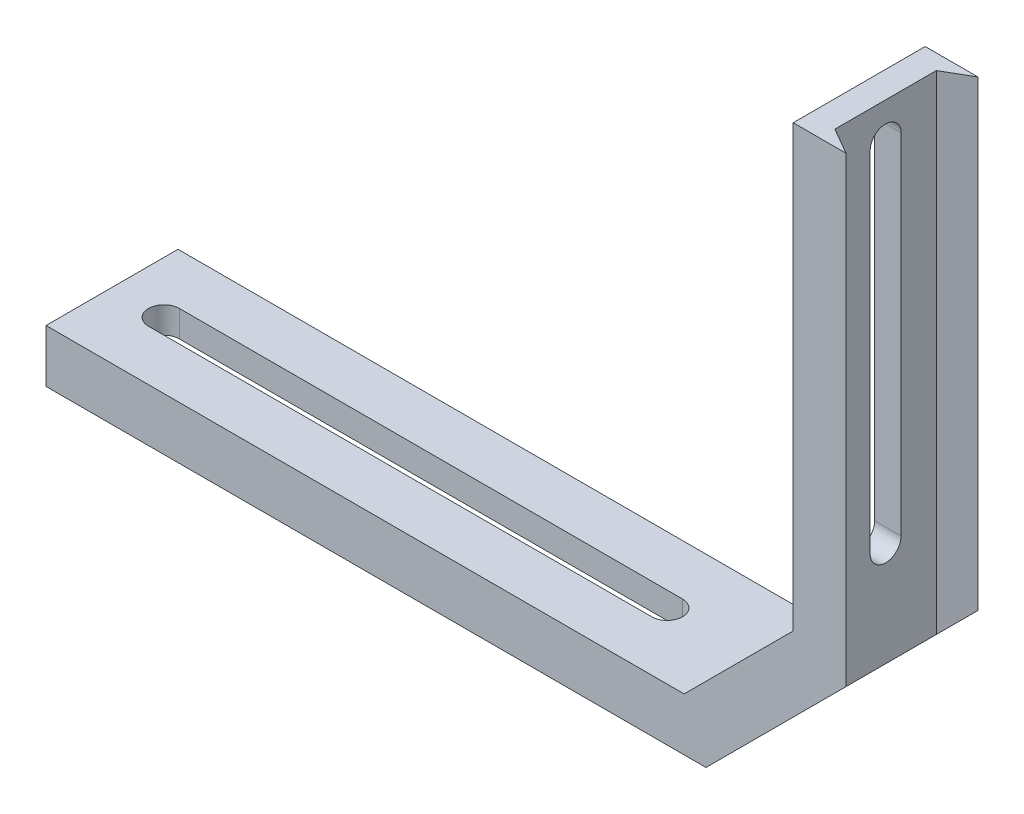
ISO-10303-21;
HEADER;
FILE_DESCRIPTION(('STEP AP214'),'2;1');
FILE_NAME('part.step','',(''),(''),'','','');
FILE_SCHEMA(('AUTOMOTIVE_DESIGN { 1 0 10303 214 1 1 1 1 }'));
ENDSEC;
DATA;
#1=APPLICATION_CONTEXT('core data for automotive mechanical design processes');
#2=APPLICATION_PROTOCOL_DEFINITION('international standard','automotive_design',2000,#1);
#3=PRODUCT_CONTEXT('',#1,'mechanical');
#4=PRODUCT('Part','Part','',(#3));
#5=PRODUCT_RELATED_PRODUCT_CATEGORY('part','',(#4));
#6=PRODUCT_DEFINITION_FORMATION('','',#4);
#7=PRODUCT_DEFINITION_CONTEXT('part definition',#1,'design');
#8=PRODUCT_DEFINITION('design','',#6,#7);
#9=PRODUCT_DEFINITION_SHAPE('','',#8);
#10=(LENGTH_UNIT() NAMED_UNIT(*) SI_UNIT(.MILLI.,.METRE.));
#11=(NAMED_UNIT(*) PLANE_ANGLE_UNIT() SI_UNIT($,.RADIAN.));
#12=(NAMED_UNIT(*) SI_UNIT($,.STERADIAN.) SOLID_ANGLE_UNIT());
#13=UNCERTAINTY_MEASURE_WITH_UNIT(LENGTH_MEASURE(1.E-05),#10,'distance_accuracy_value','');
#14=(GEOMETRIC_REPRESENTATION_CONTEXT(3) GLOBAL_UNCERTAINTY_ASSIGNED_CONTEXT((#13)) GLOBAL_UNIT_ASSIGNED_CONTEXT((#10,
#11,#12)) REPRESENTATION_CONTEXT('',''));
#15=CARTESIAN_POINT('',(0.,0.,0.));
#16=DIRECTION('',(0.,0.,1.));
#17=DIRECTION('',(1.,0.,0.));
#18=AXIS2_PLACEMENT_3D('',#15,#16,#17);
#19=CARTESIAN_POINT('',(96.6862915010152,0.,20.));
#20=DIRECTION('',(0.,-1.,0.));
#21=DIRECTION('',(1.,0.,0.));
#22=AXIS2_PLACEMENT_3D('',#19,#20,#21);
#23=PLANE('',#22);
#24=DIRECTION('',(1.,0.,0.));
#25=VECTOR('',#24,1.);
#26=CARTESIAN_POINT('',(7.87001413216025,0.,12.3364310955665));
#27=LINE('',#26,#25);
#28=CARTESIAN_POINT('',(7.87001413216025,0.,12.3364310955665));
#29=VERTEX_POINT('',#28);
#30=CARTESIAN_POINT('',(84.1044230217786,0.,12.3364310955665));
#31=VERTEX_POINT('',#30);
#32=EDGE_CURVE('E201',#29,#31,#27,.T.);
#33=ORIENTED_EDGE('',*,*,#32,.F.);
#34=CARTESIAN_POINT('',(7.87001413216025,0.,10.));
#35=DIRECTION('',(0.,1.,0.));
#36=DIRECTION('',(-1.,0.,0.));
#37=AXIS2_PLACEMENT_3D('',#34,#35,#36);
#38=CIRCLE('',#37,2.3364310955665);
#39=CARTESIAN_POINT('',(7.87001413216025,0.,7.6635689044335));
#40=VERTEX_POINT('',#39);
#41=EDGE_CURVE('E197',#40,#29,#38,.T.);
#42=ORIENTED_EDGE('',*,*,#41,.F.);
#43=DIRECTION('',(-1.,0.,0.));
#44=VECTOR('',#43,1.);
#45=CARTESIAN_POINT('',(7.87001413216025,0.,7.6635689044335));
#46=LINE('',#45,#44);
#47=CARTESIAN_POINT('',(84.1044230217786,0.,7.6635689044335));
#48=VERTEX_POINT('',#47);
#49=EDGE_CURVE('E207',#48,#40,#46,.T.);
#50=ORIENTED_EDGE('',*,*,#49,.F.);
#51=CARTESIAN_POINT('',(84.1044230217786,0.,10.));
#52=DIRECTION('',(0.,1.,0.));
#53=DIRECTION('',(-1.,0.,0.));
#54=AXIS2_PLACEMENT_3D('',#51,#52,#53);
#55=CIRCLE('',#54,2.3364310955665);
#56=EDGE_CURVE('E204',#31,#48,#55,.T.);
#57=ORIENTED_EDGE('',*,*,#56,.F.);
#58=EDGE_LOOP('',(#33,#42,#50,#57));
#59=FACE_BOUND('',#58,.T.);
#60=DIRECTION('',(-1.,0.,0.));
#61=VECTOR('',#60,1.);
#62=CARTESIAN_POINT('',(96.6862915010152,0.,0.));
#63=LINE('',#62,#61);
#64=CARTESIAN_POINT('',(96.6862915010152,0.,0.));
#65=VERTEX_POINT('',#64);
#66=CARTESIAN_POINT('',(0.,0.,0.));
#67=VERTEX_POINT('',#66);
#68=EDGE_CURVE('E258',#65,#67,#63,.T.);
#69=ORIENTED_EDGE('',*,*,#68,.T.);
#70=DIRECTION('',(0.,0.,-1.));
#71=VECTOR('',#70,1.);
#72=CARTESIAN_POINT('',(0.,0.,20.));
#73=LINE('',#72,#71);
#74=CARTESIAN_POINT('',(0.,0.,20.));
#75=VERTEX_POINT('',#74);
#76=EDGE_CURVE('E307',#75,#67,#73,.T.);
#77=ORIENTED_EDGE('',*,*,#76,.F.);
#78=DIRECTION('',(-1.,0.,0.));
#79=VECTOR('',#78,1.);
#80=CARTESIAN_POINT('',(96.6862915010152,0.,20.));
#81=LINE('',#80,#79);
#82=CARTESIAN_POINT('',(96.6862915010152,0.,20.));
#83=VERTEX_POINT('',#82);
#84=EDGE_CURVE('E259',#83,#75,#81,.T.);
#85=ORIENTED_EDGE('',*,*,#84,.F.);
#86=DIRECTION('',(0.,0.,-1.));
#87=VECTOR('',#86,1.);
#88=CARTESIAN_POINT('',(96.6862915010152,0.,20.));
#89=LINE('',#88,#87);
#90=EDGE_CURVE('E281',#83,#65,#89,.T.);
#91=ORIENTED_EDGE('',*,*,#90,.T.);
#92=EDGE_LOOP('',(#69,#77,#85,#91));
#93=FACE_BOUND('',#92,.T.);
#94=ADVANCED_FACE('F35',(#59,#93),#23,.F.);
#95=CARTESIAN_POINT('',(0.,0.,20.));
#96=DIRECTION('',(1.,0.,0.));
#97=DIRECTION('',(0.,1.,0.));
#98=AXIS2_PLACEMENT_3D('',#95,#96,#97);
#99=PLANE('',#98);
#100=DIRECTION('',(0.,-1.,0.));
#101=VECTOR('',#100,1.);
#102=CARTESIAN_POINT('',(0.,0.,0.));
#103=LINE('',#102,#101);
#104=CARTESIAN_POINT('',(0.,-8.00000000000001,0.));
#105=VERTEX_POINT('',#104);
#106=EDGE_CURVE('E284',#67,#105,#103,.T.);
#107=ORIENTED_EDGE('',*,*,#106,.T.);
#108=DIRECTION('',(0.,-0.866025403784436,-0.500000000000004));
#109=VECTOR('',#108,1.);
#110=CARTESIAN_POINT('',(0.,-8.00000000000001,0.));
#111=LINE('',#110,#109);
#112=CARTESIAN_POINT('',(0.,-4.00000000000001,2.30940107675853));
#113=VERTEX_POINT('',#112);
#114=EDGE_CURVE('E246',#113,#105,#111,.T.);
#115=ORIENTED_EDGE('',*,*,#114,.F.);
#116=DIRECTION('',(0.,0.,-1.));
#117=VECTOR('',#116,1.);
#118=CARTESIAN_POINT('',(0.,-4.00000000000001,2.30940107675853));
#119=LINE('',#118,#117);
#120=CARTESIAN_POINT('',(0.,-4.00000000000001,17.6905989232415));
#121=VERTEX_POINT('',#120);
#122=EDGE_CURVE('E243',#121,#113,#119,.T.);
#123=ORIENTED_EDGE('',*,*,#122,.F.);
#124=DIRECTION('',(0.,0.866025403784436,-0.500000000000004));
#125=VECTOR('',#124,1.);
#126=CARTESIAN_POINT('',(0.,-4.00000000000001,17.6905989232415));
#127=LINE('',#126,#125);
#128=CARTESIAN_POINT('',(0.,-8.00000000000001,20.));
#129=VERTEX_POINT('',#128);
#130=EDGE_CURVE('E240',#129,#121,#127,.T.);
#131=ORIENTED_EDGE('',*,*,#130,.F.);
#132=DIRECTION('',(0.,-1.,0.));
#133=VECTOR('',#132,1.);
#134=CARTESIAN_POINT('',(0.,0.,20.));
#135=LINE('',#134,#133);
#136=EDGE_CURVE('E262',#75,#129,#135,.T.);
#137=ORIENTED_EDGE('',*,*,#136,.F.);
#138=ORIENTED_EDGE('',*,*,#76,.T.);
#139=EDGE_LOOP('',(#107,#115,#123,#131,#137,#138));
#140=FACE_BOUND('',#139,.T.);
#141=ADVANCED_FACE('F349',(#140),#99,.F.);
#142=CARTESIAN_POINT('',(100.,-8.00000000000001,20.));
#143=DIRECTION('',(-0.707106781186549,0.707106781186546,0.));
#144=DIRECTION('',(-0.707106781186546,-0.707106781186549,0.));
#145=AXIS2_PLACEMENT_3D('',#142,#143,#144);
#146=PLANE('',#145);
#147=DIRECTION('',(0.,0.,1.));
#148=VECTOR('',#147,1.);
#149=CARTESIAN_POINT('',(117.213203435596,9.21320343559642,20.));
#150=LINE('',#149,#148);
#151=CARTESIAN_POINT('',(117.213203435596,9.21320343559642,2.30940107675853));
#152=VERTEX_POINT('',#151);
#153=CARTESIAN_POINT('',(117.213203435596,9.21320343559642,17.6905989232415));
#154=VERTEX_POINT('',#153);
#155=EDGE_CURVE('E237',#152,#154,#150,.T.);
#156=ORIENTED_EDGE('',*,*,#155,.T.);
#157=DIRECTION('',(0.654653670707975,0.654653670707978,0.37796447300923));
#158=VECTOR('',#157,1.);
#159=CARTESIAN_POINT('',(103.030457633657,-4.96954236634333,9.50218681664347));
#160=LINE('',#159,#158);
#161=CARTESIAN_POINT('',(121.213203435596,13.2132034355964,20.));
#162=VERTEX_POINT('',#161);
#163=EDGE_CURVE('E234',#154,#162,#160,.T.);
#164=ORIENTED_EDGE('',*,*,#163,.T.);
#165=DIRECTION('',(0.707106781186546,0.707106781186549,0.));
#166=VECTOR('',#165,1.);
#167=CARTESIAN_POINT('',(100.,-8.00000000000001,20.));
#168=LINE('',#167,#166);
#169=CARTESIAN_POINT('',(100.,-8.,20.));
#170=VERTEX_POINT('',#169);
#171=EDGE_CURVE('E269',#170,#162,#168,.T.);
#172=ORIENTED_EDGE('',*,*,#171,.F.);
#173=DIRECTION('',(0.654653670707975,0.654653670707977,-0.377964473009231));
#174=VECTOR('',#173,1.);
#175=CARTESIAN_POINT('',(100.,-8.00000000000001,20.));
#176=LINE('',#175,#174);
#177=CARTESIAN_POINT('',(104.,-4.,17.6905989232415));
#178=VERTEX_POINT('',#177);
#179=EDGE_CURVE('E255',#170,#178,#176,.T.);
#180=ORIENTED_EDGE('',*,*,#179,.T.);
#181=DIRECTION('',(0.,0.,-1.));
#182=VECTOR('',#181,1.);
#183=CARTESIAN_POINT('',(104.,-4.,20.));
#184=LINE('',#183,#182);
#185=CARTESIAN_POINT('',(104.,-4.,2.30940107675853));
#186=VERTEX_POINT('',#185);
#187=EDGE_CURVE('E310',#178,#186,#184,.T.);
#188=ORIENTED_EDGE('',*,*,#187,.T.);
#189=DIRECTION('',(-0.654653670707975,-0.654653670707977,-0.377964473009231));
#190=VECTOR('',#189,1.);
#191=CARTESIAN_POINT('',(104.948716593054,-3.05128340694602,2.85714285714291));
#192=LINE('',#191,#190);
#193=CARTESIAN_POINT('',(100.,-8.,0.));
#194=VERTEX_POINT('',#193);
#195=EDGE_CURVE('E251',#186,#194,#192,.T.);
#196=ORIENTED_EDGE('',*,*,#195,.T.);
#197=DIRECTION('',(0.707106781186546,0.707106781186549,0.));
#198=VECTOR('',#197,1.);
#199=CARTESIAN_POINT('',(100.,-8.00000000000001,0.));
#200=LINE('',#199,#198);
#201=CARTESIAN_POINT('',(121.213203435596,13.2132034355965,0.));
#202=VERTEX_POINT('',#201);
#203=EDGE_CURVE('E289',#194,#202,#200,.T.);
#204=ORIENTED_EDGE('',*,*,#203,.T.);
#205=DIRECTION('',(-0.654653670707975,-0.654653670707978,0.37796447300923));
#206=VECTOR('',#205,1.);
#207=CARTESIAN_POINT('',(98.0817410406027,-9.91825895939731,13.3549560404994));
#208=LINE('',#207,#206);
#209=EDGE_CURVE('E230',#202,#152,#208,.T.);
#210=ORIENTED_EDGE('',*,*,#209,.T.);
#211=EDGE_LOOP('',(#156,#164,#172,#180,#188,#196,#204,#210));
#212=FACE_BOUND('',#211,.T.);
#213=ADVANCED_FACE('F356',(#212),#146,.F.);
#214=CARTESIAN_POINT('',(121.213203435596,83.2132034355965,20.));
#215=DIRECTION('',(0.,-1.,0.));
#216=DIRECTION('',(0.,0.,-1.));
#217=AXIS2_PLACEMENT_3D('',#214,#215,#216);
#218=PLANE('',#217);
#219=DIRECTION('',(-1.,0.,0.));
#220=VECTOR('',#219,1.);
#221=CARTESIAN_POINT('',(121.213203435596,83.2132034355965,20.));
#222=LINE('',#221,#220);
#223=CARTESIAN_POINT('',(121.213203435596,83.2132034355965,20.));
#224=VERTEX_POINT('',#223);
#225=CARTESIAN_POINT('',(113.213203435596,83.2132034355965,20.));
#226=VERTEX_POINT('',#225);
#227=EDGE_CURVE('E275',#224,#226,#222,.T.);
#228=ORIENTED_EDGE('',*,*,#227,.F.);
#229=DIRECTION('',(0.866025403784436,0.,0.500000000000004));
#230=VECTOR('',#229,1.);
#231=CARTESIAN_POINT('',(117.213203435596,83.2132034355965,17.6905989232415));
#232=LINE('',#231,#230);
#233=CARTESIAN_POINT('',(117.213203435596,83.2132034355965,17.6905989232415));
#234=VERTEX_POINT('',#233);
#235=EDGE_CURVE('E225',#234,#224,#232,.T.);
#236=ORIENTED_EDGE('',*,*,#235,.F.);
#237=DIRECTION('',(0.,0.,1.));
#238=VECTOR('',#237,1.);
#239=CARTESIAN_POINT('',(117.213203435596,83.2132034355965,2.30940107675853));
#240=LINE('',#239,#238);
#241=CARTESIAN_POINT('',(117.213203435596,83.2132034355965,2.30940107675853));
#242=VERTEX_POINT('',#241);
#243=EDGE_CURVE('E222',#242,#234,#240,.T.);
#244=ORIENTED_EDGE('',*,*,#243,.F.);
#245=DIRECTION('',(-0.866025403784436,0.,0.500000000000004));
#246=VECTOR('',#245,1.);
#247=CARTESIAN_POINT('',(121.213203435596,83.2132034355965,0.));
#248=LINE('',#247,#246);
#249=CARTESIAN_POINT('',(121.213203435596,83.2132034355965,0.));
#250=VERTEX_POINT('',#249);
#251=EDGE_CURVE('E213',#250,#242,#248,.T.);
#252=ORIENTED_EDGE('',*,*,#251,.F.);
#253=DIRECTION('',(-1.,0.,0.));
#254=VECTOR('',#253,1.);
#255=CARTESIAN_POINT('',(121.213203435596,83.2132034355965,0.));
#256=LINE('',#255,#254);
#257=CARTESIAN_POINT('',(113.213203435596,83.2132034355965,0.));
#258=VERTEX_POINT('',#257);
#259=EDGE_CURVE('E294',#250,#258,#256,.T.);
#260=ORIENTED_EDGE('',*,*,#259,.T.);
#261=DIRECTION('',(0.,0.,-1.));
#262=VECTOR('',#261,1.);
#263=CARTESIAN_POINT('',(113.213203435596,83.2132034355965,20.));
#264=LINE('',#263,#262);
#265=EDGE_CURVE('E304',#226,#258,#264,.T.);
#266=ORIENTED_EDGE('',*,*,#265,.F.);
#267=EDGE_LOOP('',(#228,#236,#244,#252,#260,#266));
#268=FACE_BOUND('',#267,.T.);
#269=ADVANCED_FACE('F388',(#268),#218,.F.);
#270=CARTESIAN_POINT('',(113.213203435596,83.2132034355965,20.));
#271=DIRECTION('',(1.,0.,0.));
#272=DIRECTION('',(0.,1.,0.));
#273=AXIS2_PLACEMENT_3D('',#270,#271,#272);
#274=PLANE('',#273);
#275=DIRECTION('',(0.,-1.,0.));
#276=VECTOR('',#275,1.);
#277=CARTESIAN_POINT('',(113.213203435596,77.716506993571,7.65971379266154));
#278=LINE('',#277,#276);
#279=CARTESIAN_POINT('',(113.213203435596,77.716506993571,7.65971379266154));
#280=VERTEX_POINT('',#279);
#281=CARTESIAN_POINT('',(113.213203435596,24.8000355276402,7.65971379266154));
#282=VERTEX_POINT('',#281);
#283=EDGE_CURVE('E183',#280,#282,#278,.T.);
#284=ORIENTED_EDGE('',*,*,#283,.F.);
#285=CARTESIAN_POINT('',(113.213203435596,77.716506993571,10.));
#286=DIRECTION('',(-1.,0.,0.));
#287=DIRECTION('',(0.,-1.,0.));
#288=AXIS2_PLACEMENT_3D('',#285,#286,#287);
#289=CIRCLE('',#288,2.34028620733846);
#290=CARTESIAN_POINT('',(113.213203435596,77.716506993571,12.3402862073385));
#291=VERTEX_POINT('',#290);
#292=EDGE_CURVE('E49',#291,#280,#289,.T.);
#293=ORIENTED_EDGE('',*,*,#292,.F.);
#294=DIRECTION('',(0.,1.,0.));
#295=VECTOR('',#294,1.);
#296=CARTESIAN_POINT('',(113.213203435596,77.716506993571,12.3402862073385));
#297=LINE('',#296,#295);
#298=CARTESIAN_POINT('',(113.213203435596,24.8000355276402,12.3402862073385));
#299=VERTEX_POINT('',#298);
#300=EDGE_CURVE('E190',#299,#291,#297,.T.);
#301=ORIENTED_EDGE('',*,*,#300,.F.);
#302=CARTESIAN_POINT('',(113.213203435596,24.8000355276402,10.));
#303=DIRECTION('',(-1.,0.,0.));
#304=DIRECTION('',(0.,-1.,0.));
#305=AXIS2_PLACEMENT_3D('',#302,#303,#304);
#306=CIRCLE('',#305,2.34028620733846);
#307=EDGE_CURVE('E174',#282,#299,#306,.T.);
#308=ORIENTED_EDGE('',*,*,#307,.F.);
#309=EDGE_LOOP('',(#284,#293,#301,#308));
#310=FACE_BOUND('',#309,.T.);
#311=DIRECTION('',(0.,-1.,0.));
#312=VECTOR('',#311,1.);
#313=CARTESIAN_POINT('',(113.213203435596,83.2132034355965,0.));
#314=LINE('',#313,#312);
#315=CARTESIAN_POINT('',(113.213203435596,16.5269119345812,0.));
#316=VERTEX_POINT('',#315);
#317=EDGE_CURVE('E296',#258,#316,#314,.T.);
#318=ORIENTED_EDGE('',*,*,#317,.T.);
#319=DIRECTION('',(0.,0.,-1.));
#320=VECTOR('',#319,1.);
#321=CARTESIAN_POINT('',(113.213203435596,16.5269119345812,20.));
#322=LINE('',#321,#320);
#323=CARTESIAN_POINT('',(113.213203435596,16.5269119345812,20.));
#324=VERTEX_POINT('',#323);
#325=EDGE_CURVE('E301',#324,#316,#322,.T.);
#326=ORIENTED_EDGE('',*,*,#325,.F.);
#327=DIRECTION('',(0.,-1.,0.));
#328=VECTOR('',#327,1.);
#329=CARTESIAN_POINT('',(113.213203435596,83.2132034355965,20.));
#330=LINE('',#329,#328);
#331=EDGE_CURVE('E277',#226,#324,#330,.T.);
#332=ORIENTED_EDGE('',*,*,#331,.F.);
#333=ORIENTED_EDGE('',*,*,#265,.T.);
#334=EDGE_LOOP('',(#318,#326,#332,#333));
#335=FACE_BOUND('',#334,.T.);
#336=ADVANCED_FACE('F187',(#310,#335),#274,.F.);
#337=CARTESIAN_POINT('',(113.213203435596,16.5269119345812,20.));
#338=DIRECTION('',(0.707106781186549,-0.707106781186546,0.));
#339=DIRECTION('',(0.707106781186546,0.707106781186549,0.));
#340=AXIS2_PLACEMENT_3D('',#337,#338,#339);
#341=PLANE('',#340);
#342=DIRECTION('',(-0.707106781186546,-0.707106781186549,0.));
#343=VECTOR('',#342,1.);
#344=CARTESIAN_POINT('',(113.213203435596,16.5269119345812,0.));
#345=LINE('',#344,#343);
#346=EDGE_CURVE('E263',#316,#65,#345,.T.);
#347=ORIENTED_EDGE('',*,*,#346,.T.);
#348=ORIENTED_EDGE('',*,*,#90,.F.);
#349=DIRECTION('',(-0.707106781186546,-0.707106781186549,0.));
#350=VECTOR('',#349,1.);
#351=CARTESIAN_POINT('',(113.213203435596,16.5269119345812,20.));
#352=LINE('',#351,#350);
#353=EDGE_CURVE('E279',#324,#83,#352,.T.);
#354=ORIENTED_EDGE('',*,*,#353,.F.);
#355=ORIENTED_EDGE('',*,*,#325,.T.);
#356=EDGE_LOOP('',(#347,#348,#354,#355));
#357=FACE_BOUND('',#356,.T.);
#358=ADVANCED_FACE('F381',(#357),#341,.F.);
#359=CARTESIAN_POINT('',(0.,0.,20.));
#360=DIRECTION('',(0.,0.,1.));
#361=DIRECTION('',(1.,0.,0.));
#362=AXIS2_PLACEMENT_3D('',#359,#360,#361);
#363=PLANE('',#362);
#364=ORIENTED_EDGE('',*,*,#84,.T.);
#365=ORIENTED_EDGE('',*,*,#136,.T.);
#366=DIRECTION('',(1.,0.,0.));
#367=VECTOR('',#366,1.);
#368=CARTESIAN_POINT('',(0.,-8.00000000000001,20.));
#369=LINE('',#368,#367);
#370=EDGE_CURVE('E266',#129,#170,#369,.T.);
#371=ORIENTED_EDGE('',*,*,#370,.T.);
#372=ORIENTED_EDGE('',*,*,#171,.T.);
#373=DIRECTION('',(0.,1.,0.));
#374=VECTOR('',#373,1.);
#375=CARTESIAN_POINT('',(121.213203435596,13.2132034355965,20.));
#376=LINE('',#375,#374);
#377=EDGE_CURVE('E272',#162,#224,#376,.T.);
#378=ORIENTED_EDGE('',*,*,#377,.T.);
#379=ORIENTED_EDGE('',*,*,#227,.T.);
#380=ORIENTED_EDGE('',*,*,#331,.T.);
#381=ORIENTED_EDGE('',*,*,#353,.T.);
#382=EDGE_LOOP('',(#364,#365,#371,#372,#378,#379,#380,#381));
#383=FACE_BOUND('',#382,.T.);
#384=ADVANCED_FACE('F376',(#383),#363,.T.);
#385=CARTESIAN_POINT('',(0.,0.,0.));
#386=DIRECTION('',(0.,0.,1.));
#387=DIRECTION('',(1.,0.,0.));
#388=AXIS2_PLACEMENT_3D('',#385,#386,#387);
#389=PLANE('',#388);
#390=ORIENTED_EDGE('',*,*,#68,.F.);
#391=ORIENTED_EDGE('',*,*,#346,.F.);
#392=ORIENTED_EDGE('',*,*,#317,.F.);
#393=ORIENTED_EDGE('',*,*,#259,.F.);
#394=DIRECTION('',(0.,1.,0.));
#395=VECTOR('',#394,1.);
#396=CARTESIAN_POINT('',(121.213203435596,13.2132034355965,0.));
#397=LINE('',#396,#395);
#398=EDGE_CURVE('E292',#202,#250,#397,.T.);
#399=ORIENTED_EDGE('',*,*,#398,.F.);
#400=ORIENTED_EDGE('',*,*,#203,.F.);
#401=DIRECTION('',(1.,0.,0.));
#402=VECTOR('',#401,1.);
#403=CARTESIAN_POINT('',(0.,-8.00000000000001,0.));
#404=LINE('',#403,#402);
#405=EDGE_CURVE('E287',#105,#194,#404,.T.);
#406=ORIENTED_EDGE('',*,*,#405,.F.);
#407=ORIENTED_EDGE('',*,*,#106,.F.);
#408=EDGE_LOOP('',(#390,#391,#392,#393,#399,#400,#406,#407));
#409=FACE_BOUND('',#408,.T.);
#410=ADVANCED_FACE('F368',(#409),#389,.F.);
#411=CARTESIAN_POINT('',(121.213203435596,-4.,2.30940107675853));
#412=DIRECTION('',(0.,1.,0.));
#413=DIRECTION('',(-1.,0.,0.));
#414=AXIS2_PLACEMENT_3D('',#411,#412,#413);
#415=PLANE('',#414);
#416=DIRECTION('',(-1.,0.,0.));
#417=VECTOR('',#416,1.);
#418=CARTESIAN_POINT('',(121.213203435596,-4.,7.6635689044335));
#419=LINE('',#418,#417);
#420=CARTESIAN_POINT('',(84.1044230217786,-4.,7.6635689044335));
#421=VERTEX_POINT('',#420);
#422=CARTESIAN_POINT('',(7.87001413216025,-4.00000000000001,7.6635689044335));
#423=VERTEX_POINT('',#422);
#424=EDGE_CURVE('E319',#421,#423,#419,.T.);
#425=ORIENTED_EDGE('',*,*,#424,.T.);
#426=CARTESIAN_POINT('',(7.87001413216025,-4.00000000000001,10.));
#427=DIRECTION('',(0.,1.,0.));
#428=DIRECTION('',(-1.,0.,0.));
#429=AXIS2_PLACEMENT_3D('',#426,#427,#428);
#430=CIRCLE('',#429,2.3364310955665);
#431=CARTESIAN_POINT('',(7.87001413216025,-4.00000000000001,12.3364310955665));
#432=VERTEX_POINT('',#431);
#433=EDGE_CURVE('E322',#423,#432,#430,.T.);
#434=ORIENTED_EDGE('',*,*,#433,.T.);
#435=DIRECTION('',(1.,0.,0.));
#436=VECTOR('',#435,1.);
#437=CARTESIAN_POINT('',(121.213203435596,-4.,12.3364310955665));
#438=LINE('',#437,#436);
#439=CARTESIAN_POINT('',(84.1044230217786,-4.,12.3364310955665));
#440=VERTEX_POINT('',#439);
#441=EDGE_CURVE('E313',#432,#440,#438,.T.);
#442=ORIENTED_EDGE('',*,*,#441,.T.);
#443=CARTESIAN_POINT('',(84.1044230217786,-4.,10.));
#444=DIRECTION('',(0.,1.,0.));
#445=DIRECTION('',(-1.,0.,0.));
#446=AXIS2_PLACEMENT_3D('',#443,#444,#445);
#447=CIRCLE('',#446,2.3364310955665);
#448=EDGE_CURVE('E316',#440,#421,#447,.T.);
#449=ORIENTED_EDGE('',*,*,#448,.T.);
#450=EDGE_LOOP('',(#425,#434,#442,#449));
#451=FACE_BOUND('',#450,.T.);
#452=DIRECTION('',(-1.,0.,0.));
#453=VECTOR('',#452,1.);
#454=CARTESIAN_POINT('',(121.213203435596,-4.,17.6905989232415));
#455=LINE('',#454,#453);
#456=EDGE_CURVE('E248',#178,#121,#455,.T.);
#457=ORIENTED_EDGE('',*,*,#456,.T.);
#458=ORIENTED_EDGE('',*,*,#122,.T.);
#459=DIRECTION('',(-1.,0.,0.));
#460=VECTOR('',#459,1.);
#461=CARTESIAN_POINT('',(121.213203435596,-4.,2.30940107675853));
#462=LINE('',#461,#460);
#463=EDGE_CURVE('E249',#186,#113,#462,.T.);
#464=ORIENTED_EDGE('',*,*,#463,.F.);
#465=ORIENTED_EDGE('',*,*,#187,.F.);
#466=EDGE_LOOP('',(#457,#458,#464,#465));
#467=FACE_BOUND('',#466,.T.);
#468=ADVANCED_FACE('F399',(#451,#467),#415,.F.);
#469=CARTESIAN_POINT('',(121.213203435596,-4.,17.6905989232415));
#470=DIRECTION('',(0.,0.500000000000004,0.866025403784436));
#471=DIRECTION('',(0.,-0.866025403784436,0.500000000000004));
#472=AXIS2_PLACEMENT_3D('',#469,#470,#471);
#473=PLANE('',#472);
#474=ORIENTED_EDGE('',*,*,#370,.F.);
#475=ORIENTED_EDGE('',*,*,#130,.T.);
#476=ORIENTED_EDGE('',*,*,#456,.F.);
#477=ORIENTED_EDGE('',*,*,#179,.F.);
#478=EDGE_LOOP('',(#474,#475,#476,#477));
#479=FACE_BOUND('',#478,.T.);
#480=ADVANCED_FACE('F402',(#479),#473,.F.);
#481=CARTESIAN_POINT('',(121.213203435596,-7.99999999999999,0.));
#482=DIRECTION('',(0.,0.500000000000004,-0.866025403784436));
#483=DIRECTION('',(0.,0.866025403784436,0.500000000000004));
#484=AXIS2_PLACEMENT_3D('',#481,#482,#483);
#485=PLANE('',#484);
#486=ORIENTED_EDGE('',*,*,#463,.T.);
#487=ORIENTED_EDGE('',*,*,#114,.T.);
#488=ORIENTED_EDGE('',*,*,#405,.T.);
#489=ORIENTED_EDGE('',*,*,#195,.F.);
#490=EDGE_LOOP('',(#486,#487,#488,#489));
#491=FACE_BOUND('',#490,.T.);
#492=ADVANCED_FACE('F397',(#491),#485,.F.);
#493=CARTESIAN_POINT('',(117.213203435596,-8.00000000000001,2.30940107675853));
#494=DIRECTION('',(-1.,0.,0.));
#495=DIRECTION('',(0.,0.,1.));
#496=AXIS2_PLACEMENT_3D('',#493,#494,#495);
#497=PLANE('',#496);
#498=DIRECTION('',(0.,1.,0.));
#499=VECTOR('',#498,1.);
#500=CARTESIAN_POINT('',(117.213203435596,-8.00000000000001,12.3402862073385));
#501=LINE('',#500,#499);
#502=CARTESIAN_POINT('',(117.213203435596,24.8000355276402,12.3402862073385));
#503=VERTEX_POINT('',#502);
#504=CARTESIAN_POINT('',(117.213203435596,77.716506993571,12.3402862073385));
#505=VERTEX_POINT('',#504);
#506=EDGE_CURVE('E42',#503,#505,#501,.T.);
#507=ORIENTED_EDGE('',*,*,#506,.T.);
#508=CARTESIAN_POINT('',(117.213203435596,77.716506993571,10.));
#509=DIRECTION('',(-1.,0.,0.));
#510=DIRECTION('',(0.,0.,1.));
#511=AXIS2_PLACEMENT_3D('',#508,#509,#510);
#512=CIRCLE('',#511,2.34028620733846);
#513=CARTESIAN_POINT('',(117.213203435596,77.716506993571,7.65971379266154));
#514=VERTEX_POINT('',#513);
#515=EDGE_CURVE('E11',#505,#514,#512,.T.);
#516=ORIENTED_EDGE('',*,*,#515,.T.);
#517=DIRECTION('',(0.,-1.,0.));
#518=VECTOR('',#517,1.);
#519=CARTESIAN_POINT('',(117.213203435596,-8.00000000000001,7.65971379266154));
#520=LINE('',#519,#518);
#521=CARTESIAN_POINT('',(117.213203435596,24.8000355276402,7.65971379266154));
#522=VERTEX_POINT('',#521);
#523=EDGE_CURVE('E325',#514,#522,#520,.T.);
#524=ORIENTED_EDGE('',*,*,#523,.T.);
#525=CARTESIAN_POINT('',(117.213203435596,24.8000355276402,10.));
#526=DIRECTION('',(-1.,0.,0.));
#527=DIRECTION('',(0.,0.,1.));
#528=AXIS2_PLACEMENT_3D('',#525,#526,#527);
#529=CIRCLE('',#528,2.34028620733846);
#530=EDGE_CURVE('E177',#522,#503,#529,.T.);
#531=ORIENTED_EDGE('',*,*,#530,.T.);
#532=EDGE_LOOP('',(#507,#516,#524,#531));
#533=FACE_BOUND('',#532,.T.);
#534=DIRECTION('',(0.,1.,0.));
#535=VECTOR('',#534,1.);
#536=CARTESIAN_POINT('',(117.213203435596,-8.00000000000001,2.30940107675853));
#537=LINE('',#536,#535);
#538=EDGE_CURVE('E227',#152,#242,#537,.T.);
#539=ORIENTED_EDGE('',*,*,#538,.T.);
#540=ORIENTED_EDGE('',*,*,#243,.T.);
#541=DIRECTION('',(0.,1.,0.));
#542=VECTOR('',#541,1.);
#543=CARTESIAN_POINT('',(117.213203435596,-8.00000000000001,17.6905989232415));
#544=LINE('',#543,#542);
#545=EDGE_CURVE('E228',#154,#234,#544,.T.);
#546=ORIENTED_EDGE('',*,*,#545,.F.);
#547=ORIENTED_EDGE('',*,*,#155,.F.);
#548=EDGE_LOOP('',(#539,#540,#546,#547));
#549=FACE_BOUND('',#548,.T.);
#550=ADVANCED_FACE('F329',(#533,#549),#497,.F.);
#551=CARTESIAN_POINT('',(117.213203435596,-8.00000000000001,17.6905989232415));
#552=DIRECTION('',(-0.500000000000004,0.,0.866025403784436));
#553=DIRECTION('',(0.866025403784436,0.,0.500000000000004));
#554=AXIS2_PLACEMENT_3D('',#551,#552,#553);
#555=PLANE('',#554);
#556=ORIENTED_EDGE('',*,*,#545,.T.);
#557=ORIENTED_EDGE('',*,*,#235,.T.);
#558=ORIENTED_EDGE('',*,*,#377,.F.);
#559=ORIENTED_EDGE('',*,*,#163,.F.);
#560=EDGE_LOOP('',(#556,#557,#558,#559));
#561=FACE_BOUND('',#560,.T.);
#562=ADVANCED_FACE('F406',(#561),#555,.F.);
#563=CARTESIAN_POINT('',(121.213203435596,-8.00000000000001,0.));
#564=DIRECTION('',(-0.500000000000004,0.,-0.866025403784436));
#565=DIRECTION('',(-0.866025403784436,0.,0.500000000000004));
#566=AXIS2_PLACEMENT_3D('',#563,#564,#565);
#567=PLANE('',#566);
#568=ORIENTED_EDGE('',*,*,#398,.T.);
#569=ORIENTED_EDGE('',*,*,#251,.T.);
#570=ORIENTED_EDGE('',*,*,#538,.F.);
#571=ORIENTED_EDGE('',*,*,#209,.F.);
#572=EDGE_LOOP('',(#568,#569,#570,#571));
#573=FACE_BOUND('',#572,.T.);
#574=ADVANCED_FACE('F393',(#573),#567,.F.);
#575=CARTESIAN_POINT('',(7.87001413216025,-8.00000000000001,10.));
#576=DIRECTION('',(0.,1.,0.));
#577=DIRECTION('',(-1.,0.,0.));
#578=AXIS2_PLACEMENT_3D('',#575,#576,#577);
#579=CYLINDRICAL_SURFACE('',#578,2.3364310955665);
#580=DIRECTION('',(0.,1.,0.));
#581=VECTOR('',#580,1.);
#582=CARTESIAN_POINT('',(7.87001413216025,-8.00000000000001,7.6635689044335));
#583=LINE('',#582,#581);
#584=EDGE_CURVE('E211',#423,#40,#583,.T.);
#585=ORIENTED_EDGE('',*,*,#584,.T.);
#586=ORIENTED_EDGE('',*,*,#41,.T.);
#587=DIRECTION('',(0.,1.,0.));
#588=VECTOR('',#587,1.);
#589=CARTESIAN_POINT('',(7.87001413216025,-8.00000000000001,12.3364310955665));
#590=LINE('',#589,#588);
#591=EDGE_CURVE('E210',#432,#29,#590,.T.);
#592=ORIENTED_EDGE('',*,*,#591,.F.);
#593=ORIENTED_EDGE('',*,*,#433,.F.);
#594=EDGE_LOOP('',(#585,#586,#592,#593));
#595=FACE_BOUND('',#594,.T.);
#596=ADVANCED_FACE('F419',(#595),#579,.F.);
#597=CARTESIAN_POINT('',(7.87001413216025,-8.00000000000001,7.6635689044335));
#598=DIRECTION('',(0.,0.,-1.));
#599=DIRECTION('',(-1.,0.,0.));
#600=AXIS2_PLACEMENT_3D('',#597,#598,#599);
#601=PLANE('',#600);
#602=DIRECTION('',(0.,1.,0.));
#603=VECTOR('',#602,1.);
#604=CARTESIAN_POINT('',(84.1044230217786,-8.00000000000001,7.6635689044335));
#605=LINE('',#604,#603);
#606=EDGE_CURVE('E214',#421,#48,#605,.T.);
#607=ORIENTED_EDGE('',*,*,#606,.T.);
#608=ORIENTED_EDGE('',*,*,#49,.T.);
#609=ORIENTED_EDGE('',*,*,#584,.F.);
#610=ORIENTED_EDGE('',*,*,#424,.F.);
#611=EDGE_LOOP('',(#607,#608,#609,#610));
#612=FACE_BOUND('',#611,.T.);
#613=ADVANCED_FACE('F475',(#612),#601,.F.);
#614=CARTESIAN_POINT('',(84.1044230217786,-8.00000000000001,10.));
#615=DIRECTION('',(0.,1.,0.));
#616=DIRECTION('',(-1.,0.,0.));
#617=AXIS2_PLACEMENT_3D('',#614,#615,#616);
#618=CYLINDRICAL_SURFACE('',#617,2.3364310955665);
#619=DIRECTION('',(0.,1.,0.));
#620=VECTOR('',#619,1.);
#621=CARTESIAN_POINT('',(84.1044230217786,-8.00000000000001,12.3364310955665));
#622=LINE('',#621,#620);
#623=EDGE_CURVE('E216',#440,#31,#622,.T.);
#624=ORIENTED_EDGE('',*,*,#623,.T.);
#625=ORIENTED_EDGE('',*,*,#56,.T.);
#626=ORIENTED_EDGE('',*,*,#606,.F.);
#627=ORIENTED_EDGE('',*,*,#448,.F.);
#628=EDGE_LOOP('',(#624,#625,#626,#627));
#629=FACE_BOUND('',#628,.T.);
#630=ADVANCED_FACE('F343',(#629),#618,.F.);
#631=CARTESIAN_POINT('',(7.87001413216025,-8.00000000000001,12.3364310955665));
#632=DIRECTION('',(0.,0.,1.));
#633=DIRECTION('',(1.,0.,0.));
#634=AXIS2_PLACEMENT_3D('',#631,#632,#633);
#635=PLANE('',#634);
#636=ORIENTED_EDGE('',*,*,#591,.T.);
#637=ORIENTED_EDGE('',*,*,#32,.T.);
#638=ORIENTED_EDGE('',*,*,#623,.F.);
#639=ORIENTED_EDGE('',*,*,#441,.F.);
#640=EDGE_LOOP('',(#636,#637,#638,#639));
#641=FACE_BOUND('',#640,.T.);
#642=ADVANCED_FACE('F336',(#641),#635,.F.);
#643=CARTESIAN_POINT('',(121.213203435596,77.716506993571,10.));
#644=DIRECTION('',(-1.,0.,0.));
#645=DIRECTION('',(0.,-1.,0.));
#646=AXIS2_PLACEMENT_3D('',#643,#644,#645);
#647=CYLINDRICAL_SURFACE('',#646,2.34028620733846);
#648=DIRECTION('',(-1.,0.,0.));
#649=VECTOR('',#648,1.);
#650=CARTESIAN_POINT('',(121.213203435596,77.716506993571,12.3402862073385));
#651=LINE('',#650,#649);
#652=EDGE_CURVE('E195',#505,#291,#651,.T.);
#653=ORIENTED_EDGE('',*,*,#652,.T.);
#654=ORIENTED_EDGE('',*,*,#292,.T.);
#655=DIRECTION('',(-1.,0.,0.));
#656=VECTOR('',#655,1.);
#657=CARTESIAN_POINT('',(121.213203435596,77.716506993571,7.65971379266154));
#658=LINE('',#657,#656);
#659=EDGE_CURVE('E180',#514,#280,#658,.T.);
#660=ORIENTED_EDGE('',*,*,#659,.F.);
#661=ORIENTED_EDGE('',*,*,#515,.F.);
#662=EDGE_LOOP('',(#653,#654,#660,#661));
#663=FACE_BOUND('',#662,.T.);
#664=ADVANCED_FACE('F334',(#663),#647,.F.);
#665=CARTESIAN_POINT('',(121.213203435596,77.716506993571,12.3402862073385));
#666=DIRECTION('',(0.,0.,1.));
#667=DIRECTION('',(1.,0.,0.));
#668=AXIS2_PLACEMENT_3D('',#665,#666,#667);
#669=PLANE('',#668);
#670=DIRECTION('',(-1.,0.,0.));
#671=VECTOR('',#670,1.);
#672=CARTESIAN_POINT('',(121.213203435596,24.8000355276402,12.3402862073385));
#673=LINE('',#672,#671);
#674=EDGE_CURVE('E179',#503,#299,#673,.T.);
#675=ORIENTED_EDGE('',*,*,#674,.T.);
#676=ORIENTED_EDGE('',*,*,#300,.T.);
#677=ORIENTED_EDGE('',*,*,#652,.F.);
#678=ORIENTED_EDGE('',*,*,#506,.F.);
#679=EDGE_LOOP('',(#675,#676,#677,#678));
#680=FACE_BOUND('',#679,.T.);
#681=ADVANCED_FACE('F333',(#680),#669,.F.);
#682=CARTESIAN_POINT('',(121.213203435596,24.8000355276402,10.));
#683=DIRECTION('',(-1.,0.,0.));
#684=DIRECTION('',(0.,-1.,0.));
#685=AXIS2_PLACEMENT_3D('',#682,#683,#684);
#686=CYLINDRICAL_SURFACE('',#685,2.34028620733846);
#687=DIRECTION('',(-1.,0.,0.));
#688=VECTOR('',#687,1.);
#689=CARTESIAN_POINT('',(121.213203435596,24.8000355276402,7.65971379266154));
#690=LINE('',#689,#688);
#691=EDGE_CURVE('E57',#522,#282,#690,.T.);
#692=ORIENTED_EDGE('',*,*,#691,.T.);
#693=ORIENTED_EDGE('',*,*,#307,.T.);
#694=ORIENTED_EDGE('',*,*,#674,.F.);
#695=ORIENTED_EDGE('',*,*,#530,.F.);
#696=EDGE_LOOP('',(#692,#693,#694,#695));
#697=FACE_BOUND('',#696,.T.);
#698=ADVANCED_FACE('F171',(#697),#686,.F.);
#699=CARTESIAN_POINT('',(121.213203435596,77.716506993571,7.65971379266154));
#700=DIRECTION('',(0.,0.,-1.));
#701=DIRECTION('',(-1.,0.,0.));
#702=AXIS2_PLACEMENT_3D('',#699,#700,#701);
#703=PLANE('',#702);
#704=ORIENTED_EDGE('',*,*,#659,.T.);
#705=ORIENTED_EDGE('',*,*,#283,.T.);
#706=ORIENTED_EDGE('',*,*,#691,.F.);
#707=ORIENTED_EDGE('',*,*,#523,.F.);
#708=EDGE_LOOP('',(#704,#705,#706,#707));
#709=FACE_BOUND('',#708,.T.);
#710=ADVANCED_FACE('F184',(#709),#703,.F.);
#711=CLOSED_SHELL('',(#94,#141,#213,#269,#336,#358,#384,#410,#468,#480,#492,#550,#562,#574,#596,
#613,#630,#642,#664,#681,#698,#710));
#712=MANIFOLD_SOLID_BREP('B2',#711);
#713=ADVANCED_BREP_SHAPE_REPRESENTATION('',(#18,#712),#14);
#714=SHAPE_DEFINITION_REPRESENTATION(#9,#713);
ENDSEC;
END-ISO-10303-21;
